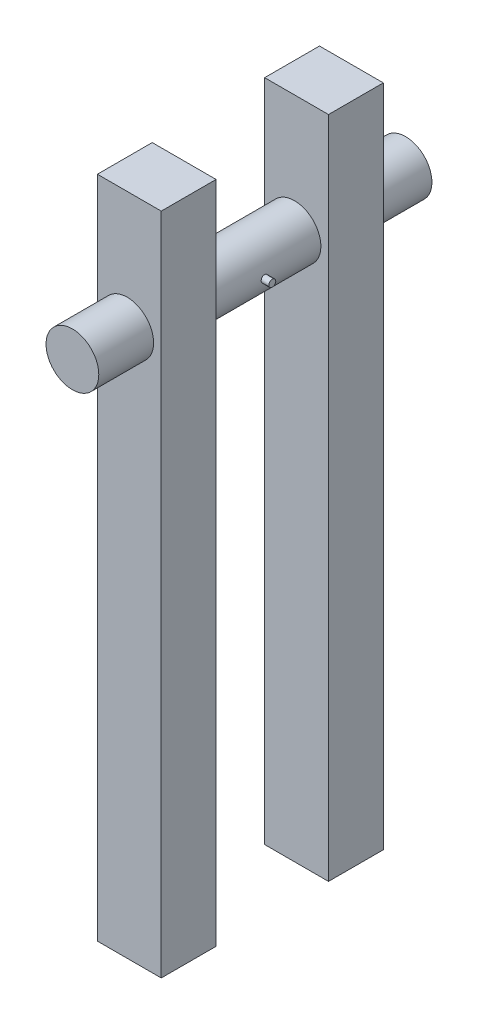
ISO-10303-21;
HEADER;
FILE_DESCRIPTION(('STEP AP214'),'2;1');
FILE_NAME('part.step','',(''),(''),'','','');
FILE_SCHEMA(('AUTOMOTIVE_DESIGN { 1 0 10303 214 1 1 1 1 }'));
ENDSEC;
DATA;
#1=APPLICATION_CONTEXT('core data for automotive mechanical design processes');
#2=APPLICATION_PROTOCOL_DEFINITION('international standard','automotive_design',2000,#1);
#3=PRODUCT_CONTEXT('',#1,'mechanical');
#4=PRODUCT('Part','Part','',(#3));
#5=PRODUCT_RELATED_PRODUCT_CATEGORY('part','',(#4));
#6=PRODUCT_DEFINITION_FORMATION('','',#4);
#7=PRODUCT_DEFINITION_CONTEXT('part definition',#1,'design');
#8=PRODUCT_DEFINITION('design','',#6,#7);
#9=PRODUCT_DEFINITION_SHAPE('','',#8);
#10=(LENGTH_UNIT() NAMED_UNIT(*) SI_UNIT(.MILLI.,.METRE.));
#11=(NAMED_UNIT(*) PLANE_ANGLE_UNIT() SI_UNIT($,.RADIAN.));
#12=(NAMED_UNIT(*) SI_UNIT($,.STERADIAN.) SOLID_ANGLE_UNIT());
#13=UNCERTAINTY_MEASURE_WITH_UNIT(LENGTH_MEASURE(1.E-05),#10,'distance_accuracy_value','');
#14=(GEOMETRIC_REPRESENTATION_CONTEXT(3) GLOBAL_UNCERTAINTY_ASSIGNED_CONTEXT((#13)) GLOBAL_UNIT_ASSIGNED_CONTEXT((#10,
#11,#12)) REPRESENTATION_CONTEXT('',''));
#15=CARTESIAN_POINT('',(0.,0.,0.));
#16=DIRECTION('',(0.,0.,1.));
#17=DIRECTION('',(1.,0.,0.));
#18=AXIS2_PLACEMENT_3D('',#15,#16,#17);
#19=CARTESIAN_POINT('',(4.3,30.1792452830189,-7.97830188679241));
#20=DIRECTION('',(0.,0.,1.));
#21=DIRECTION('',(1.,0.,0.));
#22=AXIS2_PLACEMENT_3D('',#19,#20,#21);
#23=CYLINDRICAL_SURFACE('',#22,3.8);
#24=CARTESIAN_POINT('',(4.3,30.1792452830189,8.02169811320759));
#25=DIRECTION('',(0.,0.,-1.));
#26=DIRECTION('',(0.,1.,0.));
#27=AXIS2_PLACEMENT_3D('',#24,#25,#26);
#28=CIRCLE('',#27,3.8);
#29=CARTESIAN_POINT('',(4.3,33.9792452830189,8.02169811320759));
#30=VERTEX_POINT('',#29);
#31=EDGE_CURVE('E145',#30,#30,#28,.F.);
#32=ORIENTED_EDGE('',*,*,#31,.T.);
#33=EDGE_LOOP('',(#32));
#34=FACE_BOUND('',#33,.T.);
#35=CARTESIAN_POINT('',(4.3,30.1792452830189,24.2216981132076));
#36=DIRECTION('',(0.,0.,-1.));
#37=DIRECTION('',(0.,1.,0.));
#38=AXIS2_PLACEMENT_3D('',#35,#36,#37);
#39=CIRCLE('',#38,3.8);
#40=CARTESIAN_POINT('',(4.3,33.9792452830189,24.2216981132076));
#41=VERTEX_POINT('',#40);
#42=EDGE_CURVE('E11',#41,#41,#39,.T.);
#43=ORIENTED_EDGE('',*,*,#42,.T.);
#44=EDGE_LOOP('',(#43));
#45=FACE_BOUND('',#44,.T.);
#46=CARTESIAN_POINT('',(8.1,30.1792452830189,15.6216981132076));
#47=CARTESIAN_POINT('',(8.0999995935548,30.151289619921,15.6216992930184));
#48=CARTESIAN_POINT('',(8.09968825367115,30.1233167935198,15.6240505782559));
#49=CARTESIAN_POINT('',(8.09847620844657,30.0681503882155,15.6333927124003));
#50=CARTESIAN_POINT('',(8.09757489792663,30.0409576394289,15.6403883254625));
#51=CARTESIAN_POINT('',(8.09528438746811,29.9881579544338,15.6588087013954));
#52=CARTESIAN_POINT('',(8.09389552598488,29.962549932585,15.6702303922757));
#53=CARTESIAN_POINT('',(8.0907841362443,29.9136187273532,15.6971717822988));
#54=CARTESIAN_POINT('',(8.08906166253716,29.8902951713659,15.7126908116204));
#55=CARTESIAN_POINT('',(8.08546347292886,29.8464486656431,15.7474870369828));
#56=CARTESIAN_POINT('',(8.08358697634632,29.8259415964389,15.7667841653022));
#57=CARTESIAN_POINT('',(8.07989848239198,29.7884470167251,15.8085459837416));
#58=CARTESIAN_POINT('',(8.0780864884106,29.771459690997,15.8310108400589));
#59=CARTESIAN_POINT('',(8.07472451317727,29.7414269583418,15.8785745335088));
#60=CARTESIAN_POINT('',(8.07317553882091,29.7283965557607,15.9036829220183));
#61=CARTESIAN_POINT('',(8.07052538539093,29.7067433905057,15.9557554512738));
#62=CARTESIAN_POINT('',(8.06942418753325,29.6981204429367,15.9827195141195));
#63=CARTESIAN_POINT('',(8.06780178977699,29.6855754967931,16.0375725589721));
#64=CARTESIAN_POINT('',(8.0672772702187,29.6816265818743,16.0654552852663));
#65=CARTESIAN_POINT('',(8.06685748162131,29.6784584839316,16.1214922289168));
#66=CARTESIAN_POINT('',(8.06696218463158,29.6792390908183,16.1496464341584));
#67=CARTESIAN_POINT('',(8.06778597320072,29.6854858075174,16.2052389327965));
#68=CARTESIAN_POINT('',(8.06850116040172,29.6909221877655,16.2326806327949));
#69=CARTESIAN_POINT('',(8.07045925175259,29.7062797092546,16.2862588657583));
#70=CARTESIAN_POINT('',(8.07170216764638,29.7162009503006,16.3123953696632));
#71=CARTESIAN_POINT('',(8.07458006399912,29.7402782648234,16.3627131802388));
#72=CARTESIAN_POINT('',(8.07621623004058,29.7544471768798,16.3868882730097));
#73=CARTESIAN_POINT('',(8.07969537153412,29.7866084561474,16.4325288994677));
#74=CARTESIAN_POINT('',(8.08153835745869,29.8046010170133,16.4539942958303));
#75=CARTESIAN_POINT('',(8.08524078572457,29.8440632273075,16.4937787033919));
#76=CARTESIAN_POINT('',(8.08710024586969,29.8655584864608,16.5120723201838));
#77=CARTESIAN_POINT('',(8.09061290880301,29.9113279652366,16.5447958812757));
#78=CARTESIAN_POINT('',(8.09226611102382,29.9356021925033,16.5592258149472));
#79=CARTESIAN_POINT('',(8.09518117391722,29.9862607315601,16.5838127305829));
#80=CARTESIAN_POINT('',(8.09644288060702,30.0126458684927,16.5939680318098));
#81=CARTESIAN_POINT('',(8.09843142776043,30.0667672167725,16.6096967818951));
#82=CARTESIAN_POINT('',(8.09915829598767,30.094503357909,16.6152704685883));
#83=CARTESIAN_POINT('',(8.09999164272226,30.1503199146999,16.6216446501411));
#84=CARTESIAN_POINT('',(8.10010266557811,30.1783962722231,16.6224801096061));
#85=CARTESIAN_POINT('',(8.09970410666532,30.2342886160722,16.6194465246768));
#86=CARTESIAN_POINT('',(8.09919453957634,30.2621046085412,16.6155775915622));
#87=CARTESIAN_POINT('',(8.09761488040716,30.3165827848489,16.6032741014011));
#88=CARTESIAN_POINT('',(8.09654684655832,30.3432488188198,16.59485630542));
#89=CARTESIAN_POINT('',(8.09396976963371,30.3947908211421,16.5737115269629));
#90=CARTESIAN_POINT('',(8.09246071012694,30.4196667227566,16.5609843839336));
#91=CARTESIAN_POINT('',(8.0891583576567,30.4670778901295,16.5314982262443));
#92=CARTESIAN_POINT('',(8.08736349759113,30.4895990453388,16.5147167016303));
#93=CARTESIAN_POINT('',(8.08369498947947,30.5315176489257,16.4776298663943));
#94=CARTESIAN_POINT('',(8.08182133795676,30.550914959283,16.4573244001568));
#95=CARTESIAN_POINT('',(8.07819230099204,30.5861600932851,16.4136116480427));
#96=CARTESIAN_POINT('',(8.07643773916241,30.6019846737775,16.3901855430102));
#97=CARTESIAN_POINT('',(8.07325934777675,30.62947433172,16.3409873779176));
#98=CARTESIAN_POINT('',(8.07183551099614,30.6411395000342,16.3152153691202));
#99=CARTESIAN_POINT('',(8.06948548706243,30.6599419641964,16.2621305621672));
#100=CARTESIAN_POINT('',(8.06855788446195,30.6670921491195,16.2348223946359));
#101=CARTESIAN_POINT('',(8.06730137176458,30.6767030764043,16.1793799440952));
#102=CARTESIAN_POINT('',(8.066972430549,30.6791640625129,16.1512457041027));
#103=CARTESIAN_POINT('',(8.06695145672584,30.6793219344451,16.0951810696269));
#104=CARTESIAN_POINT('',(8.06725454161047,30.6770553415809,16.067250772819));
#105=CARTESIAN_POINT('',(8.06845294503315,30.6678999613337,16.0121719103075));
#106=CARTESIAN_POINT('',(8.06934826341336,30.6610111751825,15.9850233443957));
#107=CARTESIAN_POINT('',(8.07162869529997,30.6428187525275,15.9322847169885));
#108=CARTESIAN_POINT('',(8.07301359165709,30.6315170731034,15.9066939704212));
#109=CARTESIAN_POINT('',(8.07611746940793,30.6048232659389,15.8577661683598));
#110=CARTESIAN_POINT('',(8.07783645676587,30.5894310651724,15.8344291531106));
#111=CARTESIAN_POINT('',(8.08143072009073,30.554858300067,15.7904848263216));
#112=CARTESIAN_POINT('',(8.0833070582926,30.5356505493134,15.7698989885525));
#113=CARTESIAN_POINT('',(8.08699535071187,30.4940489527469,15.7322290244587));
#114=CARTESIAN_POINT('',(8.08880728970618,30.4716543597857,15.7151457215946));
#115=CARTESIAN_POINT('',(8.09217113538462,30.4242058411348,15.684903665394));
#116=CARTESIAN_POINT('',(8.09372191597248,30.3991411233527,15.6717617260427));
#117=CARTESIAN_POINT('',(8.09637742702933,30.3471534776276,15.6498926529974));
#118=CARTESIAN_POINT('',(8.09748263637076,30.3202325812392,15.641160777074));
#119=CARTESIAN_POINT('',(8.09885950301892,30.2741881716124,15.6304232079627));
#120=CARTESIAN_POINT('',(8.09928507834336,30.2553536199562,15.6271560718131));
#121=CARTESIAN_POINT('',(8.09985546446284,30.2174304747359,15.622793130696));
#122=CARTESIAN_POINT('',(8.10000027764398,30.1983418833322,15.6216973072752));
#123=CARTESIAN_POINT('',(8.1,30.1792452830189,15.6216981132076));
#124=B_SPLINE_CURVE_WITH_KNOTS('',3,(#46,#47,#48,#49,#50,#51,#52,#53,#54,#55,#56,#57,#58,#59,
#60,#61,#62,#63,#64,#65,#66,#67,#68,#69,#70,#71,#72,#73,#74,#75,#76,#77,#78,#79,#80,#81,#82,#83,
#84,#85,#86,#87,#88,#89,#90,#91,#92,#93,#94,#95,#96,#97,#98,#99,#100,#101,#102,#103,#104,#105,
#106,#107,#108,#109,#110,#111,#112,#113,#114,#115,#116,#117,#118,#119,#120,#121,#122,#123),
.UNSPECIFIED.,.T.,.F.,(4,2,2,2,2,2,2,2,2,2,2,2,2,2,2,2,2,2,2,2,2,2,2,2,2,2,2,2,2,2,2,2,2,2,2,2,
2,2,4),(0.,0.0837972289501416,0.167680550259006,0.251505754978343,0.335317264671794,
0.419583474193991,0.503854106453316,0.588440407042865,0.673023158901242,0.7571164169641,
0.841205939556591,0.924762476076843,1.00832087213637,1.09213441422257,1.17595220218683,
1.26041284478367,1.34487371971711,1.42936777276486,1.51385743938957,1.59772281548302,
1.68158620783104,1.76514267741257,1.84870226040009,1.9327368816635,2.01677521479855,
2.10134545904575,2.18591385570571,2.27023972749564,2.35456121586382,2.43823372044234,
2.52190620272085,2.6055416190558,2.68917852859485,2.77343424323804,2.85770974409423,
2.94233981374784,3.02687868419748,3.08412131811777,3.14136346555052),.UNSPECIFIED.);
#125=CARTESIAN_POINT('',(8.1,30.1792452830189,15.6216981132076));
#126=VERTEX_POINT('',#125);
#127=EDGE_CURVE('E43',#126,#126,#124,.T.);
#128=ORIENTED_EDGE('',*,*,#127,.T.);
#129=EDGE_LOOP('',(#128));
#130=FACE_BOUND('',#129,.T.);
#131=ADVANCED_FACE('F39',(#34,#45,#130),#23,.T.);
#132=CARTESIAN_POINT('',(9.2,47.1792452830189,32.1216981132076));
#133=DIRECTION('',(0.,1.,0.));
#134=DIRECTION('',(0.,0.,1.));
#135=AXIS2_PLACEMENT_3D('',#132,#133,#134);
#136=PLANE('',#135);
#137=DIRECTION('',(0.,0.,-1.));
#138=VECTOR('',#137,1.);
#139=CARTESIAN_POINT('',(0.,47.1792452830189,32.1216981132076));
#140=LINE('',#139,#138);
#141=CARTESIAN_POINT('',(0.,47.1792452830189,32.1216981132076));
#142=VERTEX_POINT('',#141);
#143=CARTESIAN_POINT('',(0.,47.1792452830189,24.2216981132076));
#144=VERTEX_POINT('',#143);
#145=EDGE_CURVE('E160',#142,#144,#140,.T.);
#146=ORIENTED_EDGE('',*,*,#145,.F.);
#147=DIRECTION('',(-1.,0.,0.));
#148=VECTOR('',#147,1.);
#149=CARTESIAN_POINT('',(9.2,47.1792452830189,32.1216981132076));
#150=LINE('',#149,#148);
#151=CARTESIAN_POINT('',(9.2,47.1792452830189,32.1216981132076));
#152=VERTEX_POINT('',#151);
#153=EDGE_CURVE('E54',#152,#142,#150,.T.);
#154=ORIENTED_EDGE('',*,*,#153,.F.);
#155=DIRECTION('',(0.,0.,-1.));
#156=VECTOR('',#155,1.);
#157=CARTESIAN_POINT('',(9.2,47.1792452830189,32.1216981132076));
#158=LINE('',#157,#156);
#159=CARTESIAN_POINT('',(9.2,47.1792452830189,24.2216981132076));
#160=VERTEX_POINT('',#159);
#161=EDGE_CURVE('E161',#152,#160,#158,.T.);
#162=ORIENTED_EDGE('',*,*,#161,.T.);
#163=DIRECTION('',(-1.,0.,0.));
#164=VECTOR('',#163,1.);
#165=CARTESIAN_POINT('',(9.2,47.1792452830189,24.2216981132076));
#166=LINE('',#165,#164);
#167=EDGE_CURVE('E88',#160,#144,#166,.T.);
#168=ORIENTED_EDGE('',*,*,#167,.T.);
#169=EDGE_LOOP('',(#146,#154,#162,#168));
#170=FACE_BOUND('',#169,.T.);
#171=ADVANCED_FACE('F41',(#170),#136,.T.);
#172=CARTESIAN_POINT('',(9.2,47.1792452830189,32.1216981132076));
#173=DIRECTION('',(0.,0.,-1.));
#174=DIRECTION('',(0.,1.,0.));
#175=AXIS2_PLACEMENT_3D('',#172,#173,#174);
#176=PLANE('',#175);
#177=CARTESIAN_POINT('',(4.3,30.1792452830189,32.1216981132076));
#178=DIRECTION('',(0.,0.,-1.));
#179=DIRECTION('',(0.,1.,0.));
#180=AXIS2_PLACEMENT_3D('',#177,#178,#179);
#181=CIRCLE('',#180,3.8);
#182=CARTESIAN_POINT('',(4.3,33.9792452830189,32.1216981132076));
#183=VERTEX_POINT('',#182);
#184=EDGE_CURVE('E157',#183,#183,#181,.T.);
#185=ORIENTED_EDGE('',*,*,#184,.T.);
#186=EDGE_LOOP('',(#185));
#187=FACE_BOUND('',#186,.T.);
#188=DIRECTION('',(0.,-1.,0.));
#189=VECTOR('',#188,1.);
#190=CARTESIAN_POINT('',(0.,47.1792452830189,32.1216981132076));
#191=LINE('',#190,#189);
#192=CARTESIAN_POINT('',(0.,-48.5207547169811,32.1216981132076));
#193=VERTEX_POINT('',#192);
#194=EDGE_CURVE('E80',#142,#193,#191,.T.);
#195=ORIENTED_EDGE('',*,*,#194,.T.);
#196=DIRECTION('',(-1.,0.,0.));
#197=VECTOR('',#196,1.);
#198=CARTESIAN_POINT('',(9.2,-48.5207547169811,32.1216981132076));
#199=LINE('',#198,#197);
#200=CARTESIAN_POINT('',(9.2,-48.5207547169811,32.1216981132076));
#201=VERTEX_POINT('',#200);
#202=EDGE_CURVE('E179',#201,#193,#199,.T.);
#203=ORIENTED_EDGE('',*,*,#202,.F.);
#204=DIRECTION('',(0.,-1.,0.));
#205=VECTOR('',#204,1.);
#206=CARTESIAN_POINT('',(9.2,47.1792452830189,32.1216981132076));
#207=LINE('',#206,#205);
#208=EDGE_CURVE('E167',#152,#201,#207,.T.);
#209=ORIENTED_EDGE('',*,*,#208,.F.);
#210=ORIENTED_EDGE('',*,*,#153,.T.);
#211=EDGE_LOOP('',(#195,#203,#209,#210));
#212=FACE_BOUND('',#211,.T.);
#213=ADVANCED_FACE('F208',(#187,#212),#176,.F.);
#214=CARTESIAN_POINT('',(9.2,-48.5207547169811,32.1216981132076));
#215=DIRECTION('',(0.,1.,0.));
#216=DIRECTION('',(0.,0.,1.));
#217=AXIS2_PLACEMENT_3D('',#214,#215,#216);
#218=PLANE('',#217);
#219=DIRECTION('',(0.,0.,-1.));
#220=VECTOR('',#219,1.);
#221=CARTESIAN_POINT('',(0.,-48.5207547169811,32.1216981132076));
#222=LINE('',#221,#220);
#223=CARTESIAN_POINT('',(0.,-48.5207547169811,24.2216981132076));
#224=VERTEX_POINT('',#223);
#225=EDGE_CURVE('E174',#193,#224,#222,.T.);
#226=ORIENTED_EDGE('',*,*,#225,.T.);
#227=DIRECTION('',(-1.,0.,0.));
#228=VECTOR('',#227,1.);
#229=CARTESIAN_POINT('',(9.2,-48.5207547169811,24.2216981132076));
#230=LINE('',#229,#228);
#231=CARTESIAN_POINT('',(9.2,-48.5207547169811,24.2216981132076));
#232=VERTEX_POINT('',#231);
#233=EDGE_CURVE('E181',#232,#224,#230,.T.);
#234=ORIENTED_EDGE('',*,*,#233,.F.);
#235=DIRECTION('',(0.,0.,-1.));
#236=VECTOR('',#235,1.);
#237=CARTESIAN_POINT('',(9.2,-48.5207547169811,32.1216981132076));
#238=LINE('',#237,#236);
#239=EDGE_CURVE('E165',#201,#232,#238,.T.);
#240=ORIENTED_EDGE('',*,*,#239,.F.);
#241=ORIENTED_EDGE('',*,*,#202,.T.);
#242=EDGE_LOOP('',(#226,#234,#240,#241));
#243=FACE_BOUND('',#242,.T.);
#244=ADVANCED_FACE('F231',(#243),#218,.F.);
#245=CARTESIAN_POINT('',(9.2,47.1792452830189,24.2216981132076));
#246=DIRECTION('',(0.,0.,-1.));
#247=DIRECTION('',(0.,1.,0.));
#248=AXIS2_PLACEMENT_3D('',#245,#246,#247);
#249=PLANE('',#248);
#250=ORIENTED_EDGE('',*,*,#42,.F.);
#251=EDGE_LOOP('',(#250));
#252=FACE_BOUND('',#251,.T.);
#253=DIRECTION('',(0.,-1.,0.));
#254=VECTOR('',#253,1.);
#255=CARTESIAN_POINT('',(0.,47.1792452830189,24.2216981132076));
#256=LINE('',#255,#254);
#257=EDGE_CURVE('E171',#144,#224,#256,.T.);
#258=ORIENTED_EDGE('',*,*,#257,.F.);
#259=ORIENTED_EDGE('',*,*,#167,.F.);
#260=DIRECTION('',(0.,-1.,0.));
#261=VECTOR('',#260,1.);
#262=CARTESIAN_POINT('',(9.2,47.1792452830189,24.2216981132076));
#263=LINE('',#262,#261);
#264=EDGE_CURVE('E163',#160,#232,#263,.T.);
#265=ORIENTED_EDGE('',*,*,#264,.T.);
#266=ORIENTED_EDGE('',*,*,#233,.T.);
#267=EDGE_LOOP('',(#258,#259,#265,#266));
#268=FACE_BOUND('',#267,.T.);
#269=ADVANCED_FACE('F238',(#252,#268),#249,.T.);
#270=CARTESIAN_POINT('',(9.2,0.,0.));
#271=DIRECTION('',(-1.,0.,0.));
#272=DIRECTION('',(0.,0.,1.));
#273=AXIS2_PLACEMENT_3D('',#270,#271,#272);
#274=PLANE('',#273);
#275=ORIENTED_EDGE('',*,*,#161,.F.);
#276=ORIENTED_EDGE('',*,*,#208,.T.);
#277=ORIENTED_EDGE('',*,*,#239,.T.);
#278=ORIENTED_EDGE('',*,*,#264,.F.);
#279=EDGE_LOOP('',(#275,#276,#277,#278));
#280=FACE_BOUND('',#279,.T.);
#281=ADVANCED_FACE('F223',(#280),#274,.F.);
#282=CARTESIAN_POINT('',(0.,0.,0.));
#283=DIRECTION('',(-1.,0.,0.));
#284=DIRECTION('',(0.,0.,1.));
#285=AXIS2_PLACEMENT_3D('',#282,#283,#284);
#286=PLANE('',#285);
#287=ORIENTED_EDGE('',*,*,#145,.T.);
#288=ORIENTED_EDGE('',*,*,#257,.T.);
#289=ORIENTED_EDGE('',*,*,#225,.F.);
#290=ORIENTED_EDGE('',*,*,#194,.F.);
#291=EDGE_LOOP('',(#287,#288,#289,#290));
#292=FACE_BOUND('',#291,.T.);
#293=ADVANCED_FACE('F217',(#292),#286,.T.);
#294=CARTESIAN_POINT('',(4.3,30.1792452830189,40.0216981132076));
#295=DIRECTION('',(0.,0.,1.));
#296=DIRECTION('',(1.,0.,0.));
#297=AXIS2_PLACEMENT_3D('',#294,#295,#296);
#298=CIRCLE('',#297,3.8);
#299=CARTESIAN_POINT('',(8.1,30.1792452830189,40.0216981132076));
#300=VERTEX_POINT('',#299);
#301=EDGE_CURVE('E151',#300,#300,#298,.T.);
#302=ORIENTED_EDGE('',*,*,#301,.F.);
#303=EDGE_LOOP('',(#302));
#304=FACE_BOUND('',#303,.T.);
#305=ORIENTED_EDGE('',*,*,#184,.F.);
#306=EDGE_LOOP('',(#305));
#307=FACE_BOUND('',#306,.T.);
#308=ADVANCED_FACE('F198',(#304,#307),#23,.T.);
#309=CARTESIAN_POINT('',(4.3,30.1792452830189,40.0216981132076));
#310=DIRECTION('',(0.,0.,1.));
#311=DIRECTION('',(1.,0.,0.));
#312=AXIS2_PLACEMENT_3D('',#309,#310,#311);
#313=PLANE('',#312);
#314=ORIENTED_EDGE('',*,*,#301,.T.);
#315=EDGE_LOOP('',(#314));
#316=FACE_BOUND('',#315,.T.);
#317=ADVANCED_FACE('F189',(#316),#313,.T.);
#318=CARTESIAN_POINT('',(9.2,47.1792452830189,8.02169811320759));
#319=DIRECTION('',(0.,0.,-1.));
#320=DIRECTION('',(0.,1.,0.));
#321=AXIS2_PLACEMENT_3D('',#318,#319,#320);
#322=PLANE('',#321);
#323=ORIENTED_EDGE('',*,*,#31,.F.);
#324=EDGE_LOOP('',(#323));
#325=FACE_BOUND('',#324,.T.);
#326=DIRECTION('',(0.,-1.,0.));
#327=VECTOR('',#326,1.);
#328=CARTESIAN_POINT('',(0.,47.1792452830189,8.02169811320759));
#329=LINE('',#328,#327);
#330=CARTESIAN_POINT('',(0.,47.1792452830189,8.02169811320759));
#331=VERTEX_POINT('',#330);
#332=CARTESIAN_POINT('',(0.,-48.5207547169811,8.02169811320758));
#333=VERTEX_POINT('',#332);
#334=EDGE_CURVE('E141',#331,#333,#329,.T.);
#335=ORIENTED_EDGE('',*,*,#334,.T.);
#336=DIRECTION('',(-1.,0.,0.));
#337=VECTOR('',#336,1.);
#338=CARTESIAN_POINT('',(9.2,-48.5207547169811,8.02169811320758));
#339=LINE('',#338,#337);
#340=CARTESIAN_POINT('',(9.2,-48.5207547169811,8.02169811320758));
#341=VERTEX_POINT('',#340);
#342=EDGE_CURVE('E121',#341,#333,#339,.T.);
#343=ORIENTED_EDGE('',*,*,#342,.F.);
#344=DIRECTION('',(0.,-1.,0.));
#345=VECTOR('',#344,1.);
#346=CARTESIAN_POINT('',(9.2,47.1792452830189,8.02169811320759));
#347=LINE('',#346,#345);
#348=CARTESIAN_POINT('',(9.2,47.1792452830189,8.02169811320759));
#349=VERTEX_POINT('',#348);
#350=EDGE_CURVE('E128',#349,#341,#347,.T.);
#351=ORIENTED_EDGE('',*,*,#350,.F.);
#352=DIRECTION('',(-1.,0.,0.));
#353=VECTOR('',#352,1.);
#354=CARTESIAN_POINT('',(9.2,47.1792452830189,8.02169811320759));
#355=LINE('',#354,#353);
#356=EDGE_CURVE('E264',#349,#331,#355,.T.);
#357=ORIENTED_EDGE('',*,*,#356,.T.);
#358=EDGE_LOOP('',(#335,#343,#351,#357));
#359=FACE_BOUND('',#358,.T.);
#360=ADVANCED_FACE('F139',(#325,#359),#322,.F.);
#361=CARTESIAN_POINT('',(9.2,-48.5207547169811,8.02169811320758));
#362=DIRECTION('',(0.,1.,0.));
#363=DIRECTION('',(0.,0.,1.));
#364=AXIS2_PLACEMENT_3D('',#361,#362,#363);
#365=PLANE('',#364);
#366=DIRECTION('',(0.,0.,-1.));
#367=VECTOR('',#366,1.);
#368=CARTESIAN_POINT('',(0.,-48.5207547169811,8.02169811320758));
#369=LINE('',#368,#367);
#370=CARTESIAN_POINT('',(0.,-48.5207547169811,0.121698113207582));
#371=VERTEX_POINT('',#370);
#372=EDGE_CURVE('E256',#333,#371,#369,.T.);
#373=ORIENTED_EDGE('',*,*,#372,.T.);
#374=DIRECTION('',(-1.,0.,0.));
#375=VECTOR('',#374,1.);
#376=CARTESIAN_POINT('',(9.2,-48.5207547169811,0.121698113207582));
#377=LINE('',#376,#375);
#378=CARTESIAN_POINT('',(9.2,-48.5207547169811,0.121698113207582));
#379=VERTEX_POINT('',#378);
#380=EDGE_CURVE('E124',#379,#371,#377,.T.);
#381=ORIENTED_EDGE('',*,*,#380,.F.);
#382=DIRECTION('',(0.,0.,-1.));
#383=VECTOR('',#382,1.);
#384=CARTESIAN_POINT('',(9.2,-48.5207547169811,8.02169811320758));
#385=LINE('',#384,#383);
#386=EDGE_CURVE('E117',#341,#379,#385,.T.);
#387=ORIENTED_EDGE('',*,*,#386,.F.);
#388=ORIENTED_EDGE('',*,*,#342,.T.);
#389=EDGE_LOOP('',(#373,#381,#387,#388));
#390=FACE_BOUND('',#389,.T.);
#391=ADVANCED_FACE('F119',(#390),#365,.F.);
#392=CARTESIAN_POINT('',(9.2,47.1792452830189,0.121698113207589));
#393=DIRECTION('',(0.,0.,1.));
#394=DIRECTION('',(0.,-1.,0.));
#395=AXIS2_PLACEMENT_3D('',#392,#393,#394);
#396=PLANE('',#395);
#397=CARTESIAN_POINT('',(4.3,30.1792452830189,0.121698113207587));
#398=DIRECTION('',(0.,0.,1.));
#399=DIRECTION('',(0.,-1.,0.));
#400=AXIS2_PLACEMENT_3D('',#397,#398,#399);
#401=CIRCLE('',#400,3.8);
#402=CARTESIAN_POINT('',(4.3,26.3792452830189,0.121698113207587));
#403=VERTEX_POINT('',#402);
#404=EDGE_CURVE('E142',#403,#403,#401,.F.);
#405=ORIENTED_EDGE('',*,*,#404,.F.);
#406=EDGE_LOOP('',(#405));
#407=FACE_BOUND('',#406,.T.);
#408=DIRECTION('',(0.,1.,0.));
#409=VECTOR('',#408,1.);
#410=CARTESIAN_POINT('',(0.,47.1792452830189,0.121698113207589));
#411=LINE('',#410,#409);
#412=CARTESIAN_POINT('',(0.,47.1792452830189,0.121698113207589));
#413=VERTEX_POINT('',#412);
#414=EDGE_CURVE('E267',#371,#413,#411,.T.);
#415=ORIENTED_EDGE('',*,*,#414,.T.);
#416=DIRECTION('',(-1.,0.,0.));
#417=VECTOR('',#416,1.);
#418=CARTESIAN_POINT('',(9.2,47.1792452830189,0.121698113207589));
#419=LINE('',#418,#417);
#420=CARTESIAN_POINT('',(9.2,47.1792452830189,0.121698113207589));
#421=VERTEX_POINT('',#420);
#422=EDGE_CURVE('E147',#421,#413,#419,.T.);
#423=ORIENTED_EDGE('',*,*,#422,.F.);
#424=DIRECTION('',(0.,1.,0.));
#425=VECTOR('',#424,1.);
#426=CARTESIAN_POINT('',(9.2,47.1792452830189,0.121698113207589));
#427=LINE('',#426,#425);
#428=EDGE_CURVE('E127',#379,#421,#427,.T.);
#429=ORIENTED_EDGE('',*,*,#428,.F.);
#430=ORIENTED_EDGE('',*,*,#380,.T.);
#431=EDGE_LOOP('',(#415,#423,#429,#430));
#432=FACE_BOUND('',#431,.T.);
#433=ADVANCED_FACE('F195',(#407,#432),#396,.F.);
#434=CARTESIAN_POINT('',(9.2,47.1792452830189,8.02169811320759));
#435=DIRECTION('',(0.,-1.,0.));
#436=DIRECTION('',(0.,0.,-1.));
#437=AXIS2_PLACEMENT_3D('',#434,#435,#436);
#438=PLANE('',#437);
#439=DIRECTION('',(0.,0.,1.));
#440=VECTOR('',#439,1.);
#441=CARTESIAN_POINT('',(0.,47.1792452830189,8.02169811320759));
#442=LINE('',#441,#440);
#443=EDGE_CURVE('E137',#413,#331,#442,.T.);
#444=ORIENTED_EDGE('',*,*,#443,.T.);
#445=ORIENTED_EDGE('',*,*,#356,.F.);
#446=DIRECTION('',(0.,0.,1.));
#447=VECTOR('',#446,1.);
#448=CARTESIAN_POINT('',(9.2,47.1792452830189,8.02169811320759));
#449=LINE('',#448,#447);
#450=EDGE_CURVE('E133',#421,#349,#449,.T.);
#451=ORIENTED_EDGE('',*,*,#450,.F.);
#452=ORIENTED_EDGE('',*,*,#422,.T.);
#453=EDGE_LOOP('',(#444,#445,#451,#452));
#454=FACE_BOUND('',#453,.T.);
#455=ADVANCED_FACE('F274',(#454),#438,.F.);
#456=CARTESIAN_POINT('',(9.2,0.,0.));
#457=DIRECTION('',(1.,0.,0.));
#458=DIRECTION('',(0.,0.,-1.));
#459=AXIS2_PLACEMENT_3D('',#456,#457,#458);
#460=PLANE('',#459);
#461=ORIENTED_EDGE('',*,*,#350,.T.);
#462=ORIENTED_EDGE('',*,*,#386,.T.);
#463=ORIENTED_EDGE('',*,*,#428,.T.);
#464=ORIENTED_EDGE('',*,*,#450,.T.);
#465=EDGE_LOOP('',(#461,#462,#463,#464));
#466=FACE_BOUND('',#465,.T.);
#467=ADVANCED_FACE('F131',(#466),#460,.T.);
#468=CARTESIAN_POINT('',(0.,0.,0.));
#469=DIRECTION('',(1.,0.,0.));
#470=DIRECTION('',(0.,0.,-1.));
#471=AXIS2_PLACEMENT_3D('',#468,#469,#470);
#472=PLANE('',#471);
#473=ORIENTED_EDGE('',*,*,#334,.F.);
#474=ORIENTED_EDGE('',*,*,#443,.F.);
#475=ORIENTED_EDGE('',*,*,#414,.F.);
#476=ORIENTED_EDGE('',*,*,#372,.F.);
#477=EDGE_LOOP('',(#473,#474,#475,#476));
#478=FACE_BOUND('',#477,.T.);
#479=ADVANCED_FACE('F278',(#478),#472,.F.);
#480=CARTESIAN_POINT('',(4.3,30.1792452830189,-7.97830188679241));
#481=DIRECTION('',(0.,0.,1.));
#482=DIRECTION('',(1.,0.,0.));
#483=AXIS2_PLACEMENT_3D('',#480,#481,#482);
#484=PLANE('',#483);
#485=CARTESIAN_POINT('',(4.3,30.1792452830189,-7.97830188679241));
#486=DIRECTION('',(0.,0.,1.));
#487=DIRECTION('',(1.,0.,0.));
#488=AXIS2_PLACEMENT_3D('',#485,#486,#487);
#489=CIRCLE('',#488,3.8);
#490=CARTESIAN_POINT('',(8.1,30.1792452830189,-7.97830188679241));
#491=VERTEX_POINT('',#490);
#492=EDGE_CURVE('E154',#491,#491,#489,.T.);
#493=ORIENTED_EDGE('',*,*,#492,.F.);
#494=EDGE_LOOP('',(#493));
#495=FACE_BOUND('',#494,.T.);
#496=ADVANCED_FACE('F214',(#495),#484,.F.);
#497=ORIENTED_EDGE('',*,*,#492,.T.);
#498=EDGE_LOOP('',(#497));
#499=FACE_BOUND('',#498,.T.);
#500=ORIENTED_EDGE('',*,*,#404,.T.);
#501=EDGE_LOOP('',(#500));
#502=FACE_BOUND('',#501,.T.);
#503=ADVANCED_FACE('F202',(#499,#502),#23,.T.);
#504=CARTESIAN_POINT('',(9.2001,30.1792452830189,16.1216981132076));
#505=DIRECTION('',(-1.,0.,0.));
#506=DIRECTION('',(0.,0.,1.));
#507=AXIS2_PLACEMENT_3D('',#504,#505,#506);
#508=CYLINDRICAL_SURFACE('',#507,0.499999999999999);
#509=ORIENTED_EDGE('',*,*,#127,.F.);
#510=EDGE_LOOP('',(#509));
#511=FACE_BOUND('',#510,.T.);
#512=CARTESIAN_POINT('',(9.2001,30.1792452830189,16.1216981132076));
#513=DIRECTION('',(1.,0.,0.));
#514=DIRECTION('',(0.,0.,-1.));
#515=AXIS2_PLACEMENT_3D('',#512,#513,#514);
#516=CIRCLE('',#515,0.499999999999999);
#517=CARTESIAN_POINT('',(9.2001,30.1792452830189,15.6216981132076));
#518=VERTEX_POINT('',#517);
#519=EDGE_CURVE('E255',#518,#518,#516,.T.);
#520=ORIENTED_EDGE('',*,*,#519,.F.);
#521=EDGE_LOOP('',(#520));
#522=FACE_BOUND('',#521,.T.);
#523=ADVANCED_FACE('F213',(#511,#522),#508,.T.);
#524=CARTESIAN_POINT('',(9.2001,30.1792452830189,16.1216981132076));
#525=DIRECTION('',(1.,0.,0.));
#526=DIRECTION('',(0.,0.,-1.));
#527=AXIS2_PLACEMENT_3D('',#524,#525,#526);
#528=PLANE('',#527);
#529=ORIENTED_EDGE('',*,*,#519,.T.);
#530=EDGE_LOOP('',(#529));
#531=FACE_BOUND('',#530,.T.);
#532=ADVANCED_FACE('F294',(#531),#528,.T.);
#533=CLOSED_SHELL('',(#131,#171,#213,#244,#269,#281,#293,#308,#317,#360,#391,#433,#455,#467,
#479,#496,#503,#523,#532));
#534=MANIFOLD_SOLID_BREP('B2',#533);
#535=ADVANCED_BREP_SHAPE_REPRESENTATION('',(#18,#534),#14);
#536=SHAPE_DEFINITION_REPRESENTATION(#9,#535);
ENDSEC;
END-ISO-10303-21;
